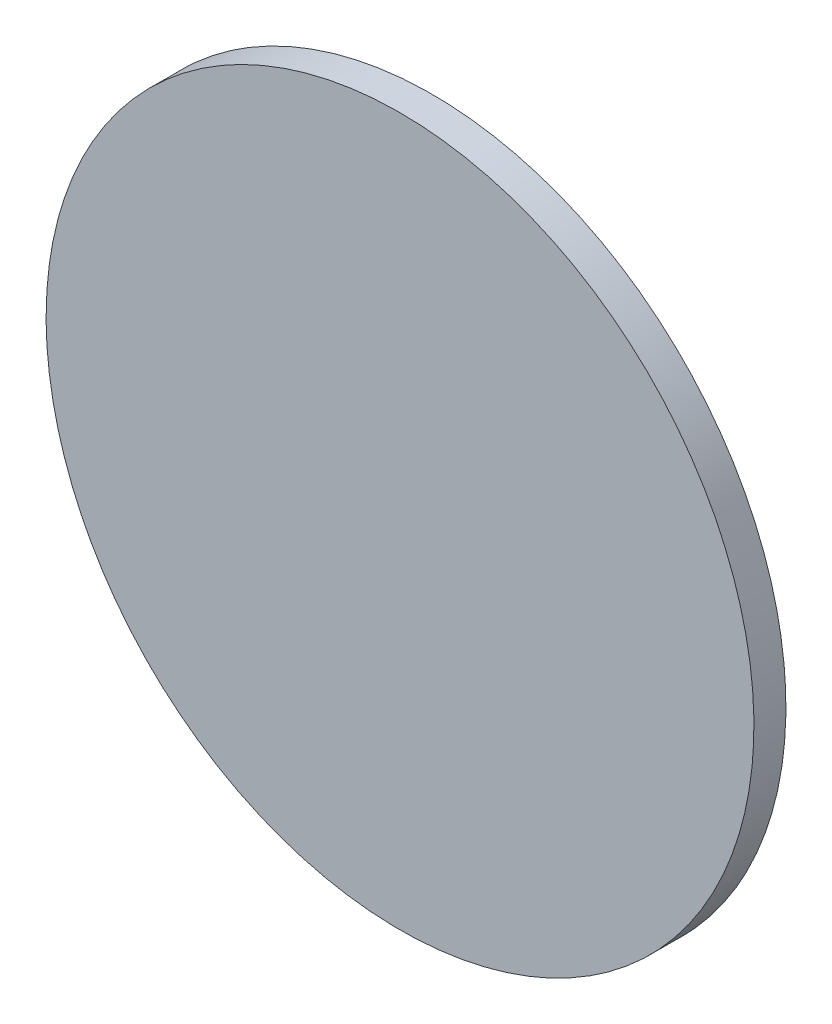
ISO-10303-21;
HEADER;
FILE_DESCRIPTION(('STEP AP214'),'2;1');
FILE_NAME('part.step','',(''),(''),'','','');
FILE_SCHEMA(('AUTOMOTIVE_DESIGN { 1 0 10303 214 1 1 1 1 }'));
ENDSEC;
DATA;
#1=APPLICATION_CONTEXT('core data for automotive mechanical design processes');
#2=APPLICATION_PROTOCOL_DEFINITION('international standard','automotive_design',2000,#1);
#3=PRODUCT_CONTEXT('',#1,'mechanical');
#4=PRODUCT('Part','Part','',(#3));
#5=PRODUCT_RELATED_PRODUCT_CATEGORY('part','',(#4));
#6=PRODUCT_DEFINITION_FORMATION('','',#4);
#7=PRODUCT_DEFINITION_CONTEXT('part definition',#1,'design');
#8=PRODUCT_DEFINITION('design','',#6,#7);
#9=PRODUCT_DEFINITION_SHAPE('','',#8);
#10=(LENGTH_UNIT() NAMED_UNIT(*) SI_UNIT(.MILLI.,.METRE.));
#11=(NAMED_UNIT(*) PLANE_ANGLE_UNIT() SI_UNIT($,.RADIAN.));
#12=(NAMED_UNIT(*) SI_UNIT($,.STERADIAN.) SOLID_ANGLE_UNIT());
#13=UNCERTAINTY_MEASURE_WITH_UNIT(LENGTH_MEASURE(1.E-05),#10,'distance_accuracy_value','');
#14=(GEOMETRIC_REPRESENTATION_CONTEXT(3) GLOBAL_UNCERTAINTY_ASSIGNED_CONTEXT((#13)) GLOBAL_UNIT_ASSIGNED_CONTEXT((#10,
#11,#12)) REPRESENTATION_CONTEXT('',''));
#15=CARTESIAN_POINT('',(0.,0.,0.));
#16=DIRECTION('',(0.,0.,1.));
#17=DIRECTION('',(1.,0.,0.));
#18=AXIS2_PLACEMENT_3D('',#15,#16,#17);
#19=CARTESIAN_POINT('',(-436.583744518887,45.0553215198781,-2472.10581086716));
#20=CARTESIAN_POINT('',(-436.583744518887,55.1504735299684,-2472.10581086716));
#21=CARTESIAN_POINT('',(-435.591858486488,75.340777550149,-2472.10581086716));
#22=CARTESIAN_POINT('',(-431.14269994776,105.334568083134,-2472.10581086716));
#23=CARTESIAN_POINT('',(-423.775059747786,134.747836519727,-2472.10581086716));
#24=CARTESIAN_POINT('',(-413.559892289257,163.297317005955,-2472.10581086716));
#25=CARTESIAN_POINT('',(-400.595575218975,190.708062438002,-2472.10581086716));
#26=CARTESIAN_POINT('',(-385.006961997343,216.716092353121,-2472.10581086716));
#27=CARTESIAN_POINT('',(-366.94417949129,241.070935205793,-2472.10581086716));
#28=CARTESIAN_POINT('',(-346.581182170468,263.538040545635,-2472.10581086716));
#29=CARTESIAN_POINT('',(-324.114076830626,283.901037866456,-2472.10581086716));
#30=CARTESIAN_POINT('',(-299.759233977955,301.963820372509,-2472.10581086716));
#31=CARTESIAN_POINT('',(-273.751204062836,317.552433594141,-2472.10581086716));
#32=CARTESIAN_POINT('',(-246.340458630789,330.516750664423,-2472.10581086716));
#33=CARTESIAN_POINT('',(-217.790978144561,340.731918122953,-2472.10581086716));
#34=CARTESIAN_POINT('',(-188.377709707968,348.099558322926,-2472.10581086716));
#35=CARTESIAN_POINT('',(-158.383919174983,352.548716861654,-2472.10581086716));
#36=CARTESIAN_POINT('',(-128.098463144712,354.036545910253,-2472.10581086716));
#37=CARTESIAN_POINT('',(-97.8130071144409,352.548716861655,-2472.10581086716));
#38=CARTESIAN_POINT('',(-67.819216581456,348.099558322926,-2472.10581086716));
#39=CARTESIAN_POINT('',(-38.4059481448631,340.731918122953,-2472.10581086716));
#40=CARTESIAN_POINT('',(-9.85646765863512,330.516750664423,-2472.10581086716));
#41=CARTESIAN_POINT('',(17.5542777734124,317.552433594141,-2472.10581086716));
#42=CARTESIAN_POINT('',(43.5623076885309,301.963820372509,-2472.10581086716));
#43=CARTESIAN_POINT('',(67.9171505412025,283.901037866456,-2472.10581086716));
#44=CARTESIAN_POINT('',(90.3842558810449,263.538040545635,-2472.10581086716));
#45=CARTESIAN_POINT('',(110.747253201866,241.070935205793,-2472.10581086716));
#46=CARTESIAN_POINT('',(128.810035707919,216.716092353121,-2472.10581086716));
#47=CARTESIAN_POINT('',(144.398648929551,190.708062438002,-2472.10581086716));
#48=CARTESIAN_POINT('',(157.362965999833,163.297317005955,-2472.10581086716));
#49=CARTESIAN_POINT('',(167.578133458363,134.747836519727,-2472.10581086716));
#50=CARTESIAN_POINT('',(174.945773658336,105.334568083134,-2472.10581086716));
#51=CARTESIAN_POINT('',(179.394932197064,75.340777550149,-2472.10581086716));
#52=CARTESIAN_POINT('',(180.882761245663,45.0553215198782,-2472.10581086716));
#53=CARTESIAN_POINT('',(179.394932197065,14.7698654896071,-2472.10581086716));
#54=CARTESIAN_POINT('',(174.945773658336,-15.2239250433776,-2472.10581086716));
#55=CARTESIAN_POINT('',(167.578133458363,-44.6371934799706,-2472.10581086716));
#56=CARTESIAN_POINT('',(157.362965999833,-73.1866739661985,-2472.10581086716));
#57=CARTESIAN_POINT('',(144.398648929551,-100.597419398246,-2472.10581086716));
#58=CARTESIAN_POINT('',(128.810035707919,-126.605449313365,-2472.10581086716));
#59=CARTESIAN_POINT('',(110.747253201866,-150.960292166036,-2472.10581086716));
#60=CARTESIAN_POINT('',(90.3842558810448,-173.427397505879,-2472.10581086716));
#61=CARTESIAN_POINT('',(67.9171505412026,-193.790394826699,-2472.10581086716));
#62=CARTESIAN_POINT('',(43.5623076885308,-211.853177332753,-2472.10581086716));
#63=CARTESIAN_POINT('',(17.5542777734126,-227.441790554384,-2472.10581086716));
#64=CARTESIAN_POINT('',(-9.856467658635,-240.406107624667,-2472.10581086716));
#65=CARTESIAN_POINT('',(-38.4059481448629,-250.621275083197,-2472.10581086716));
#66=CARTESIAN_POINT('',(-67.8192165814558,-257.988915283169,-2472.10581086716));
#67=CARTESIAN_POINT('',(-97.8130071144408,-262.438073821898,-2472.10581086716));
#68=CARTESIAN_POINT('',(-128.098463144712,-263.925902870497,-2472.10581086716));
#69=CARTESIAN_POINT('',(-158.383919174983,-262.438073821898,-2472.10581086716));
#70=CARTESIAN_POINT('',(-188.377709707968,-257.98891528317,-2472.10581086716));
#71=CARTESIAN_POINT('',(-217.790978144561,-250.621275083196,-2472.10581086716));
#72=CARTESIAN_POINT('',(-246.340458630789,-240.406107624667,-2472.10581086716));
#73=CARTESIAN_POINT('',(-273.751204062836,-227.441790554385,-2472.10581086716));
#74=CARTESIAN_POINT('',(-299.759233977955,-211.853177332753,-2472.10581086716));
#75=CARTESIAN_POINT('',(-324.114076830626,-193.790394826699,-2472.10581086716));
#76=CARTESIAN_POINT('',(-346.581182170469,-173.427397505879,-2472.10581086716));
#77=CARTESIAN_POINT('',(-366.944179491289,-150.960292166036,-2472.10581086716));
#78=CARTESIAN_POINT('',(-385.006961997343,-126.605449313365,-2472.10581086716));
#79=CARTESIAN_POINT('',(-400.595575218974,-100.597419398246,-2472.10581086716));
#80=CARTESIAN_POINT('',(-413.559892289257,-73.1866739661988,-2472.10581086716));
#81=CARTESIAN_POINT('',(-423.775059747787,-44.6371934799708,-2472.10581086716));
#82=CARTESIAN_POINT('',(-431.142699947759,-15.2239250433779,-2472.10581086716));
#83=CARTESIAN_POINT('',(-435.591858486488,14.7698654896072,-2472.10581086716));
#84=CARTESIAN_POINT('',(-436.583744518887,34.9601695097878,-2472.10581086716));
#85=CARTESIAN_POINT('',(-436.583744518887,45.0553215198781,-2472.10581086716));
#86=B_SPLINE_CURVE_WITH_KNOTS('',3,(#19,#20,#21,#22,#23,#24,#25,#26,#27,#28,#29,#30,#31,#32,#33,
#34,#35,#36,#37,#38,#39,#40,#41,#42,#43,#44,#45,#46,#47,#48,#49,#50,#51,#52,#53,#54,#55,#56,#57,
#58,#59,#60,#61,#62,#63,#64,#65,#66,#67,#68,#69,#70,#71,#72,#73,#74,#75,#76,#77,#78,#79,#80,#81,
#82,#83,#84,#85),.UNSPECIFIED.,.T.,.F.,(4,1,1,1,1,1,1,1,1,1,1,1,1,1,1,1,1,1,1,1,1,1,1,1,1,1,1,1,
1,1,1,1,1,1,1,1,1,1,1,1,1,1,1,1,1,1,1,1,1,1,1,1,1,1,1,1,1,1,1,1,1,1,1,1,4),(0.,0.015625,0.03125,
0.046875,0.0625,0.078125,0.09375,0.109375,0.125,0.140625,0.15625,0.171875,0.1875,0.203125,
0.21875,0.234375,0.25,0.265625,0.28125,0.296875,0.3125,0.328125,0.34375,0.359375,0.375,0.390625,
0.40625,0.421875,0.4375,0.453125,0.46875,0.484375,0.5,0.515625,0.53125,0.546875,0.5625,0.578125,
0.59375,0.609375,0.625,0.640625,0.65625,0.671875,0.6875,0.703125,0.71875,0.734375,0.75,0.765625,
0.78125,0.796875,0.8125,0.828125,0.84375,0.859375,0.875,0.890625,0.90625,0.921875,0.9375,
0.953125,0.96875,0.984375,1.),.UNSPECIFIED.);
#87=DIRECTION('',(0.,0.,-1.));
#88=VECTOR('',#87,1.);
#89=SURFACE_OF_LINEAR_EXTRUSION('',#86,#88);
#90=CARTESIAN_POINT('',(-436.583744518887,45.0553215198781,-2472.10581086716));
#91=CARTESIAN_POINT('',(-436.583744518887,55.1504735299684,-2472.10581086716));
#92=CARTESIAN_POINT('',(-435.591858486488,75.340777550149,-2472.10581086716));
#93=CARTESIAN_POINT('',(-431.14269994776,105.334568083134,-2472.10581086716));
#94=CARTESIAN_POINT('',(-423.775059747786,134.747836519727,-2472.10581086716));
#95=CARTESIAN_POINT('',(-413.559892289257,163.297317005955,-2472.10581086716));
#96=CARTESIAN_POINT('',(-400.595575218975,190.708062438002,-2472.10581086716));
#97=CARTESIAN_POINT('',(-385.006961997343,216.716092353121,-2472.10581086716));
#98=CARTESIAN_POINT('',(-366.94417949129,241.070935205793,-2472.10581086716));
#99=CARTESIAN_POINT('',(-346.581182170468,263.538040545635,-2472.10581086716));
#100=CARTESIAN_POINT('',(-324.114076830626,283.901037866456,-2472.10581086716));
#101=CARTESIAN_POINT('',(-299.759233977955,301.963820372509,-2472.10581086716));
#102=CARTESIAN_POINT('',(-273.751204062836,317.552433594141,-2472.10581086716));
#103=CARTESIAN_POINT('',(-246.340458630789,330.516750664423,-2472.10581086716));
#104=CARTESIAN_POINT('',(-217.790978144561,340.731918122953,-2472.10581086716));
#105=CARTESIAN_POINT('',(-188.377709707968,348.099558322926,-2472.10581086716));
#106=CARTESIAN_POINT('',(-158.383919174983,352.548716861654,-2472.10581086716));
#107=CARTESIAN_POINT('',(-128.098463144712,354.036545910253,-2472.10581086716));
#108=CARTESIAN_POINT('',(-97.8130071144409,352.548716861655,-2472.10581086716));
#109=CARTESIAN_POINT('',(-67.819216581456,348.099558322926,-2472.10581086716));
#110=CARTESIAN_POINT('',(-38.4059481448631,340.731918122953,-2472.10581086716));
#111=CARTESIAN_POINT('',(-9.85646765863512,330.516750664423,-2472.10581086716));
#112=CARTESIAN_POINT('',(17.5542777734124,317.552433594141,-2472.10581086716));
#113=CARTESIAN_POINT('',(43.5623076885309,301.963820372509,-2472.10581086716));
#114=CARTESIAN_POINT('',(67.9171505412025,283.901037866456,-2472.10581086716));
#115=CARTESIAN_POINT('',(90.3842558810449,263.538040545635,-2472.10581086716));
#116=CARTESIAN_POINT('',(110.747253201866,241.070935205793,-2472.10581086716));
#117=CARTESIAN_POINT('',(128.810035707919,216.716092353121,-2472.10581086716));
#118=CARTESIAN_POINT('',(144.398648929551,190.708062438002,-2472.10581086716));
#119=CARTESIAN_POINT('',(157.362965999833,163.297317005955,-2472.10581086716));
#120=CARTESIAN_POINT('',(167.578133458363,134.747836519727,-2472.10581086716));
#121=CARTESIAN_POINT('',(174.945773658336,105.334568083134,-2472.10581086716));
#122=CARTESIAN_POINT('',(179.394932197064,75.340777550149,-2472.10581086716));
#123=CARTESIAN_POINT('',(180.882761245663,45.0553215198782,-2472.10581086716));
#124=CARTESIAN_POINT('',(179.394932197065,14.7698654896071,-2472.10581086716));
#125=CARTESIAN_POINT('',(174.945773658336,-15.2239250433776,-2472.10581086716));
#126=CARTESIAN_POINT('',(167.578133458363,-44.6371934799706,-2472.10581086716));
#127=CARTESIAN_POINT('',(157.362965999833,-73.1866739661985,-2472.10581086716));
#128=CARTESIAN_POINT('',(144.398648929551,-100.597419398246,-2472.10581086716));
#129=CARTESIAN_POINT('',(128.810035707919,-126.605449313365,-2472.10581086716));
#130=CARTESIAN_POINT('',(110.747253201866,-150.960292166036,-2472.10581086716));
#131=CARTESIAN_POINT('',(90.3842558810448,-173.427397505879,-2472.10581086716));
#132=CARTESIAN_POINT('',(67.9171505412026,-193.790394826699,-2472.10581086716));
#133=CARTESIAN_POINT('',(43.5623076885308,-211.853177332753,-2472.10581086716));
#134=CARTESIAN_POINT('',(17.5542777734126,-227.441790554384,-2472.10581086716));
#135=CARTESIAN_POINT('',(-9.856467658635,-240.406107624667,-2472.10581086716));
#136=CARTESIAN_POINT('',(-38.4059481448629,-250.621275083197,-2472.10581086716));
#137=CARTESIAN_POINT('',(-67.8192165814558,-257.988915283169,-2472.10581086716));
#138=CARTESIAN_POINT('',(-97.8130071144408,-262.438073821898,-2472.10581086716));
#139=CARTESIAN_POINT('',(-128.098463144712,-263.925902870497,-2472.10581086716));
#140=CARTESIAN_POINT('',(-158.383919174983,-262.438073821898,-2472.10581086716));
#141=CARTESIAN_POINT('',(-188.377709707968,-257.98891528317,-2472.10581086716));
#142=CARTESIAN_POINT('',(-217.790978144561,-250.621275083196,-2472.10581086716));
#143=CARTESIAN_POINT('',(-246.340458630789,-240.406107624667,-2472.10581086716));
#144=CARTESIAN_POINT('',(-273.751204062836,-227.441790554385,-2472.10581086716));
#145=CARTESIAN_POINT('',(-299.759233977955,-211.853177332753,-2472.10581086716));
#146=CARTESIAN_POINT('',(-324.114076830626,-193.790394826699,-2472.10581086716));
#147=CARTESIAN_POINT('',(-346.581182170469,-173.427397505879,-2472.10581086716));
#148=CARTESIAN_POINT('',(-366.944179491289,-150.960292166036,-2472.10581086716));
#149=CARTESIAN_POINT('',(-385.006961997343,-126.605449313365,-2472.10581086716));
#150=CARTESIAN_POINT('',(-400.595575218974,-100.597419398246,-2472.10581086716));
#151=CARTESIAN_POINT('',(-413.559892289257,-73.1866739661988,-2472.10581086716));
#152=CARTESIAN_POINT('',(-423.775059747787,-44.6371934799708,-2472.10581086716));
#153=CARTESIAN_POINT('',(-431.142699947759,-15.2239250433779,-2472.10581086716));
#154=CARTESIAN_POINT('',(-435.591858486488,14.7698654896072,-2472.10581086716));
#155=CARTESIAN_POINT('',(-436.583744518887,34.9601695097878,-2472.10581086716));
#156=CARTESIAN_POINT('',(-436.583744518887,45.0553215198781,-2472.10581086716));
#157=B_SPLINE_CURVE_WITH_KNOTS('',3,(#90,#91,#92,#93,#94,#95,#96,#97,#98,#99,#100,#101,#102,
#103,#104,#105,#106,#107,#108,#109,#110,#111,#112,#113,#114,#115,#116,#117,#118,#119,#120,#121,
#122,#123,#124,#125,#126,#127,#128,#129,#130,#131,#132,#133,#134,#135,#136,#137,#138,#139,#140,
#141,#142,#143,#144,#145,#146,#147,#148,#149,#150,#151,#152,#153,#154,#155,#156),.UNSPECIFIED.,
.T.,.F.,(4,1,1,1,1,1,1,1,1,1,1,1,1,1,1,1,1,1,1,1,1,1,1,1,1,1,1,1,1,1,1,1,1,1,1,1,1,1,1,1,1,1,1,
1,1,1,1,1,1,1,1,1,1,1,1,1,1,1,1,1,1,1,1,1,4),(0.,0.015625,0.03125,0.046875,0.0625,0.078125,
0.09375,0.109375,0.125,0.140625,0.15625,0.171875,0.1875,0.203125,0.21875,0.234375,0.25,0.265625,
0.28125,0.296875,0.3125,0.328125,0.34375,0.359375,0.375,0.390625,0.40625,0.421875,0.4375,
0.453125,0.46875,0.484375,0.5,0.515625,0.53125,0.546875,0.5625,0.578125,0.59375,0.609375,0.625,
0.640625,0.65625,0.671875,0.6875,0.703125,0.71875,0.734375,0.75,0.765625,0.78125,0.796875,
0.8125,0.828125,0.84375,0.859375,0.875,0.890625,0.90625,0.921875,0.9375,0.953125,0.96875,
0.984375,1.),.UNSPECIFIED.);
#158=CARTESIAN_POINT('',(-436.583744518887,45.0553215198781,-2472.10581086716));
#159=VERTEX_POINT('',#158);
#160=EDGE_CURVE('E9',#159,#159,#157,.T.);
#161=ORIENTED_EDGE('',*,*,#160,.T.);
#162=EDGE_LOOP('',(#161));
#163=FACE_BOUND('',#162,.T.);
#164=CARTESIAN_POINT('',(-436.583744518887,45.0553215198781,-2499.99899999999));
#165=CARTESIAN_POINT('',(-436.583744518887,40.007745514833,-2499.99899999999));
#166=CARTESIAN_POINT('',(-436.459758764838,34.9601695097878,-2499.99899999999));
#167=CARTESIAN_POINT('',(-435.964412773932,24.8771702287511,-2499.99899999999));
#168=CARTESIAN_POINT('',(-435.593052537077,19.8417469527596,-2499.99899999999));
#169=CARTESIAN_POINT('',(-434.603554605856,9.79520585888358,-2499.99899999999));
#170=CARTESIAN_POINT('',(-433.98541691149,4.78408804099918,-2499.99899999999));
#171=CARTESIAN_POINT('',(-432.504149391451,-5.20180644503305,-2499.99899999999));
#172=CARTESIAN_POINT('',(-431.641019565777,-10.1765831131809,-2499.99899999999));
#173=CARTESIAN_POINT('',(-429.671553109327,-20.0777596081105,-2499.99899999999));
#174=CARTESIAN_POINT('',(-428.56521647855,-25.0041594348923,-2499.99899999999));
#175=CARTESIAN_POINT('',(-426.112292845338,-34.7967795031744,-2499.99899999999));
#176=CARTESIAN_POINT('',(-424.765705842902,-39.6629997446746,-2499.99899999999));
#177=CARTESIAN_POINT('',(-421.835237899819,-49.3234578984781,-2499.99899999999));
#178=CARTESIAN_POINT('',(-420.25135695917,-54.1176958107813,-2499.99899999999));
#179=CARTESIAN_POINT('',(-416.850400208277,-63.622733176865,-2499.99899999999));
#180=CARTESIAN_POINT('',(-415.033324398032,-68.3335326306455,-2499.99899999999));
#181=CARTESIAN_POINT('',(-411.170076976564,-77.660236950358,-2499.99899999999));
#182=CARTESIAN_POINT('',(-409.12390536534,-82.2761418162901,-2499.99899999999));
#183=CARTESIAN_POINT('',(-404.807668569429,-91.4020577743581,-2499.99899999999));
#184=CARTESIAN_POINT('',(-402.537603384742,-95.912068866494,-2499.99899999999));
#185=CARTESIAN_POINT('',(-397.778781669424,-104.815198091022,-2499.99899999999));
#186=CARTESIAN_POINT('',(-395.290025138791,-109.208316223414,-2499.99899999999));
#187=CARTESIAN_POINT('',(-390.100076017703,-117.867223214057,-2499.99899999999));
#188=CARTESIAN_POINT('',(-387.398883427246,-122.133012072308,-2499.99899999999));
#189=CARTESIAN_POINT('',(-381.790317472632,-130.526824200273,-2499.99899999999));
#190=CARTESIAN_POINT('',(-378.882944108474,-134.654847469987,-2499.99899999999));
#191=CARTESIAN_POINT('',(-372.869264709359,-142.763355485444,-2499.99899999999));
#192=CARTESIAN_POINT('',(-369.762958674401,-146.743840231189,-2499.99899999999));
#193=CARTESIAN_POINT('',(-363.358662036589,-154.547498263274,-2499.99899999999));
#194=CARTESIAN_POINT('',(-360.060671433734,-158.370671549616,-2499.99899999999));
#195=CARTESIAN_POINT('',(-353.281176776616,-165.850691225138,-2499.99899999999));
#196=CARTESIAN_POINT('',(-349.799672722354,-169.50753761432,-2499.99899999999));
#197=CARTESIAN_POINT('',(-342.66132227891,-176.645888057763,-2499.99899999999));
#198=CARTESIAN_POINT('',(-339.004475889729,-180.127392112026,-2499.99899999999));
#199=CARTESIAN_POINT('',(-331.524456214206,-186.906886769144,-2499.99899999999));
#200=CARTESIAN_POINT('',(-327.701282927864,-190.204877371999,-2499.99899999999));
#201=CARTESIAN_POINT('',(-319.897624895779,-196.609174009811,-2499.99899999999));
#202=CARTESIAN_POINT('',(-315.917140150035,-199.715480044768,-2499.99899999999));
#203=CARTESIAN_POINT('',(-307.808632134577,-205.729159443884,-2499.99899999999));
#204=CARTESIAN_POINT('',(-303.680608864863,-208.636532808042,-2499.99899999999));
#205=CARTESIAN_POINT('',(-295.286796736898,-214.245098762656,-2499.99899999999));
#206=CARTESIAN_POINT('',(-291.021007878647,-216.946291353112,-2499.99899999999));
#207=CARTESIAN_POINT('',(-282.362100888004,-222.136240474201,-2499.99899999999));
#208=CARTESIAN_POINT('',(-277.968982755612,-224.624997004833,-2499.99899999999));
#209=CARTESIAN_POINT('',(-269.065853531084,-229.383818720152,-2499.99899999999));
#210=CARTESIAN_POINT('',(-264.555842438949,-231.653883904839,-2499.99899999999));
#211=CARTESIAN_POINT('',(-255.42992648088,-235.97012070075,-2499.99899999999));
#212=CARTESIAN_POINT('',(-250.814021614948,-238.016292311974,-2499.99899999999));
#213=CARTESIAN_POINT('',(-241.487317295236,-241.879539733442,-2499.99899999999));
#214=CARTESIAN_POINT('',(-236.776517841455,-243.696615543687,-2499.99899999999));
#215=CARTESIAN_POINT('',(-227.271480475372,-247.09757229458,-2499.99899999999));
#216=CARTESIAN_POINT('',(-222.477242563069,-248.681453235228,-2499.99899999999));
#217=CARTESIAN_POINT('',(-212.816784409265,-251.611921178312,-2499.99899999999));
#218=CARTESIAN_POINT('',(-207.950564167765,-252.958508180748,-2499.99899999999));
#219=CARTESIAN_POINT('',(-198.157944099483,-255.41143181396,-2499.99899999999));
#220=CARTESIAN_POINT('',(-193.231544272701,-256.517768444737,-2499.99899999999));
#221=CARTESIAN_POINT('',(-183.330367777771,-258.487234901187,-2499.99899999999));
#222=CARTESIAN_POINT('',(-178.355591109623,-259.350364726861,-2499.99899999999));
#223=CARTESIAN_POINT('',(-168.369696623591,-260.8316322469,-2499.99899999999));
#224=CARTESIAN_POINT('',(-163.358578805707,-261.449769941266,-2499.99899999999));
#225=CARTESIAN_POINT('',(-153.312037711831,-262.439267872487,-2499.99899999999));
#226=CARTESIAN_POINT('',(-148.276614435839,-262.810628109342,-2499.99899999999));
#227=CARTESIAN_POINT('',(-138.193615154803,-263.305974100248,-2499.99899999999));
#228=CARTESIAN_POINT('',(-133.146039149758,-263.429959854298,-2499.99899999999));
#229=CARTESIAN_POINT('',(-123.050887139667,-263.429959854298,-2499.99899999999));
#230=CARTESIAN_POINT('',(-118.003311134622,-263.305974100248,-2499.99899999999));
#231=CARTESIAN_POINT('',(-107.920311853585,-262.810628109343,-2499.99899999999));
#232=CARTESIAN_POINT('',(-102.884888577594,-262.439267872487,-2499.99899999999));
#233=CARTESIAN_POINT('',(-92.8383474837178,-261.449769941266,-2499.99899999999));
#234=CARTESIAN_POINT('',(-87.8272296658334,-260.8316322469,-2499.99899999999));
#235=CARTESIAN_POINT('',(-77.8413351798011,-259.350364726861,-2499.99899999999));
#236=CARTESIAN_POINT('',(-72.8665585116533,-258.487234901187,-2499.99899999999));
#237=CARTESIAN_POINT('',(-62.9653820167237,-256.517768444737,-2499.99899999999));
#238=CARTESIAN_POINT('',(-58.0389821899419,-255.41143181396,-2499.99899999999));
#239=CARTESIAN_POINT('',(-48.2463621216598,-252.958508180748,-2499.99899999999));
#240=CARTESIAN_POINT('',(-43.3801418801595,-251.611921178312,-2499.99899999999));
#241=CARTESIAN_POINT('',(-33.7196837263561,-248.681453235229,-2499.99899999999));
#242=CARTESIAN_POINT('',(-28.9254458140529,-247.09757229458,-2499.99899999999));
#243=CARTESIAN_POINT('',(-19.4204084479692,-243.696615543687,-2499.99899999999));
#244=CARTESIAN_POINT('',(-14.7096089941887,-241.879539733443,-2499.99899999999));
#245=CARTESIAN_POINT('',(-5.38290467447612,-238.016292311974,-2499.99899999999));
#246=CARTESIAN_POINT('',(-0.766999808544001,-235.97012070075,-2499.99899999999));
#247=CARTESIAN_POINT('',(8.358916149524,-231.653883904839,-2499.99899999999));
#248=CARTESIAN_POINT('',(12.8689272416599,-229.383818720153,-2499.99899999999));
#249=CARTESIAN_POINT('',(21.7720564661876,-224.624997004834,-2499.99899999999));
#250=CARTESIAN_POINT('',(26.1651745985794,-222.136240474201,-2499.99899999999));
#251=CARTESIAN_POINT('',(34.8240815892223,-216.946291353113,-2499.99899999999));
#252=CARTESIAN_POINT('',(39.0898704474734,-214.245098762657,-2499.99899999999));
#253=CARTESIAN_POINT('',(47.4836825754384,-208.636532808043,-2499.99899999999));
#254=CARTESIAN_POINT('',(51.6117058451524,-205.729159443885,-2499.99899999999));
#255=CARTESIAN_POINT('',(59.7202138606103,-199.715480044769,-2499.99899999999));
#256=CARTESIAN_POINT('',(63.7006986063544,-196.609174009811,-2499.99899999999));
#257=CARTESIAN_POINT('',(71.5043566384401,-190.204877371999,-2499.99899999999));
#258=CARTESIAN_POINT('',(75.3275299247816,-186.906886769144,-2499.99899999999));
#259=CARTESIAN_POINT('',(82.8075496003044,-180.127392112027,-2499.99899999999));
#260=CARTESIAN_POINT('',(86.4643959894856,-176.645888057764,-2499.99899999999));
#261=CARTESIAN_POINT('',(93.6027464329294,-169.50753761432,-2499.99899999999));
#262=CARTESIAN_POINT('',(97.0842504871922,-165.850691225139,-2499.99899999999));
#263=CARTESIAN_POINT('',(103.86374514431,-158.370671549616,-2499.99899999999));
#264=CARTESIAN_POINT('',(107.161735747165,-154.547498263275,-2499.99899999999));
#265=CARTESIAN_POINT('',(113.566032384977,-146.743840231189,-2499.99899999999));
#266=CARTESIAN_POINT('',(116.672338419935,-142.763355485445,-2499.99899999999));
#267=CARTESIAN_POINT('',(122.68601781905,-134.654847469987,-2499.99899999999));
#268=CARTESIAN_POINT('',(125.593391183208,-130.526824200273,-2499.99899999999));
#269=CARTESIAN_POINT('',(131.201957137822,-122.133012072308,-2499.99899999999));
#270=CARTESIAN_POINT('',(133.903149728278,-117.867223214057,-2499.99899999999));
#271=CARTESIAN_POINT('',(139.093098849367,-109.208316223414,-2499.99899999999));
#272=CARTESIAN_POINT('',(141.581855379999,-104.815198091022,-2499.99899999999));
#273=CARTESIAN_POINT('',(146.340677095318,-95.9120688664947,-2499.99899999999));
#274=CARTESIAN_POINT('',(148.610742280005,-91.4020577743588,-2499.99899999999));
#275=CARTESIAN_POINT('',(152.926979075916,-82.2761418162908,-2499.99899999999));
#276=CARTESIAN_POINT('',(154.97315068714,-77.6602369503586,-2499.99899999999));
#277=CARTESIAN_POINT('',(158.836398108609,-68.333532630646,-2499.99899999999));
#278=CARTESIAN_POINT('',(160.653473918853,-63.6227331768655,-2499.99899999999));
#279=CARTESIAN_POINT('',(164.054430669746,-54.1176958107817,-2499.99899999999));
#280=CARTESIAN_POINT('',(165.638311610395,-49.3234578984785,-2499.99899999999));
#281=CARTESIAN_POINT('',(168.568779553479,-39.662999744675,-2499.99899999999));
#282=CARTESIAN_POINT('',(169.915366555914,-34.7967795031748,-2499.99899999999));
#283=CARTESIAN_POINT('',(172.368290189126,-25.0041594348926,-2499.99899999999));
#284=CARTESIAN_POINT('',(173.474626819903,-20.0777596081108,-2499.99899999999));
#285=CARTESIAN_POINT('',(175.444093276354,-10.1765831131812,-2499.99899999999));
#286=CARTESIAN_POINT('',(176.307223102027,-5.20180644503341,-2499.99899999999));
#287=CARTESIAN_POINT('',(177.788490622066,4.78408804099877,-2499.99899999999));
#288=CARTESIAN_POINT('',(178.406628316432,9.79520585888316,-2499.99899999999));
#289=CARTESIAN_POINT('',(179.396126247653,19.8417469527591,-2499.99899999999));
#290=CARTESIAN_POINT('',(179.767486484509,24.8771702287507,-2499.99899999999));
#291=CARTESIAN_POINT('',(180.262832475414,34.9601695097874,-2499.99899999999));
#292=CARTESIAN_POINT('',(180.386818229464,40.0077455148326,-2499.99899999999));
#293=CARTESIAN_POINT('',(180.386818229464,50.1028975249229,-2499.99899999999));
#294=CARTESIAN_POINT('',(180.262832475414,55.150473529968,-2499.99899999999));
#295=CARTESIAN_POINT('',(179.767486484509,65.2334728110047,-2499.99899999999));
#296=CARTESIAN_POINT('',(179.396126247654,70.2688960869963,-2499.99899999999));
#297=CARTESIAN_POINT('',(178.406628316432,80.3154371808723,-2499.99899999999));
#298=CARTESIAN_POINT('',(177.788490622066,85.3265549987567,-2499.99899999999));
#299=CARTESIAN_POINT('',(176.307223102027,95.312449484789,-2499.99899999999));
#300=CARTESIAN_POINT('',(175.444093276354,100.287226152937,-2499.99899999999));
#301=CARTESIAN_POINT('',(173.474626819903,110.188402647866,-2499.99899999999));
#302=CARTESIAN_POINT('',(172.368290189126,115.114802474648,-2499.99899999999));
#303=CARTESIAN_POINT('',(169.915366555914,124.90742254293,-2499.99899999999));
#304=CARTESIAN_POINT('',(168.568779553479,129.773642784431,-2499.99899999999));
#305=CARTESIAN_POINT('',(165.638311610395,139.434100938234,-2499.99899999999));
#306=CARTESIAN_POINT('',(164.054430669746,144.228338850537,-2499.99899999999));
#307=CARTESIAN_POINT('',(160.653473918853,153.733376216621,-2499.99899999999));
#308=CARTESIAN_POINT('',(158.836398108609,158.444175670402,-2499.99899999999));
#309=CARTESIAN_POINT('',(154.97315068714,167.770879990114,-2499.99899999999));
#310=CARTESIAN_POINT('',(152.926979075916,172.386784856046,-2499.99899999999));
#311=CARTESIAN_POINT('',(148.610742280005,181.512700814114,-2499.99899999999));
#312=CARTESIAN_POINT('',(146.340677095319,186.02271190625,-2499.99899999999));
#313=CARTESIAN_POINT('',(141.58185538,194.925841130778,-2499.99899999999));
#314=CARTESIAN_POINT('',(139.093098849367,199.31895926317,-2499.99899999999));
#315=CARTESIAN_POINT('',(133.903149728279,207.977866253813,-2499.99899999999));
#316=CARTESIAN_POINT('',(131.201957137823,212.243655112064,-2499.99899999999));
#317=CARTESIAN_POINT('',(125.593391183209,220.637467240029,-2499.99899999999));
#318=CARTESIAN_POINT('',(122.686017819051,224.765490509743,-2499.99899999999));
#319=CARTESIAN_POINT('',(116.672338419935,232.873998525201,-2499.99899999999));
#320=CARTESIAN_POINT('',(113.566032384977,236.854483270945,-2499.99899999999));
#321=CARTESIAN_POINT('',(107.161735747165,244.65814130303,-2499.99899999999));
#322=CARTESIAN_POINT('',(103.86374514431,248.481314589372,-2499.99899999999));
#323=CARTESIAN_POINT('',(97.0842504871927,255.961334264895,-2499.99899999999));
#324=CARTESIAN_POINT('',(93.60274643293,259.618180654076,-2499.99899999999));
#325=CARTESIAN_POINT('',(86.4643959894862,266.756531097519,-2499.99899999999));
#326=CARTESIAN_POINT('',(82.807549600305,270.238035151782,-2499.99899999999));
#327=CARTESIAN_POINT('',(75.3275299247822,277.0175298089,-2499.99899999999));
#328=CARTESIAN_POINT('',(71.5043566384406,280.315520411755,-2499.99899999999));
#329=CARTESIAN_POINT('',(63.700698606355,286.719817049567,-2499.99899999999));
#330=CARTESIAN_POINT('',(59.7202138606109,289.826123084525,-2499.99899999999));
#331=CARTESIAN_POINT('',(51.611705845153,295.83980248364,-2499.99899999999));
#332=CARTESIAN_POINT('',(47.4836825754391,298.747175847798,-2499.99899999999));
#333=CARTESIAN_POINT('',(39.089870447474,304.355741802413,-2499.99899999999));
#334=CARTESIAN_POINT('',(34.8240815892229,307.056934392869,-2499.99899999999));
#335=CARTESIAN_POINT('',(26.16517459858,312.246883513957,-2499.99899999999));
#336=CARTESIAN_POINT('',(21.7720564661882,314.73564004459,-2499.99899999999));
#337=CARTESIAN_POINT('',(12.8689272416605,319.494461759909,-2499.99899999999));
#338=CARTESIAN_POINT('',(8.35891614952465,321.764526944595,-2499.99899999999));
#339=CARTESIAN_POINT('',(-0.766999808543327,326.080763740506,-2499.99899999999));
#340=CARTESIAN_POINT('',(-5.38290467447544,328.12693535173,-2499.99899999999));
#341=CARTESIAN_POINT('',(-14.709608994188,331.990182773199,-2499.99899999999));
#342=CARTESIAN_POINT('',(-19.4204084479685,333.807258583443,-2499.99899999999));
#343=CARTESIAN_POINT('',(-28.9254458140522,337.208215334336,-2499.99899999999));
#344=CARTESIAN_POINT('',(-33.7196837263554,338.792096274985,-2499.99899999999));
#345=CARTESIAN_POINT('',(-43.3801418801588,341.722564218069,-2499.99899999999));
#346=CARTESIAN_POINT('',(-48.2463621216591,343.069151220504,-2499.99899999999));
#347=CARTESIAN_POINT('',(-58.0389821899412,345.522074853716,-2499.99899999999));
#348=CARTESIAN_POINT('',(-62.9653820167231,346.628411484493,-2499.99899999999));
#349=CARTESIAN_POINT('',(-72.8665585116527,348.597877940944,-2499.99899999999));
#350=CARTESIAN_POINT('',(-77.8413351798005,349.461007766617,-2499.99899999999));
#351=CARTESIAN_POINT('',(-87.8272296658328,350.942275286656,-2499.99899999999));
#352=CARTESIAN_POINT('',(-92.8383474837172,351.560412981022,-2499.99899999999));
#353=CARTESIAN_POINT('',(-102.884888577593,352.549910912243,-2499.99899999999));
#354=CARTESIAN_POINT('',(-107.920311853585,352.921271149099,-2499.99899999999));
#355=CARTESIAN_POINT('',(-118.003311134621,353.416617140004,-2499.99899999999));
#356=CARTESIAN_POINT('',(-123.050887139667,353.540602894054,-2499.99899999999));
#357=CARTESIAN_POINT('',(-133.146039149757,353.540602894054,-2499.99899999999));
#358=CARTESIAN_POINT('',(-138.193615154802,353.416617140004,-2499.99899999999));
#359=CARTESIAN_POINT('',(-148.276614435839,352.921271149099,-2499.99899999999));
#360=CARTESIAN_POINT('',(-153.31203771183,352.549910912243,-2499.99899999999));
#361=CARTESIAN_POINT('',(-163.358578805706,351.560412981022,-2499.99899999999));
#362=CARTESIAN_POINT('',(-168.369696623591,350.942275286656,-2499.99899999999));
#363=CARTESIAN_POINT('',(-178.355591109623,349.461007766617,-2499.99899999999));
#364=CARTESIAN_POINT('',(-183.330367777771,348.597877940944,-2499.99899999999));
#365=CARTESIAN_POINT('',(-193.2315442727,346.628411484493,-2499.99899999999));
#366=CARTESIAN_POINT('',(-198.157944099482,345.522074853716,-2499.99899999999));
#367=CARTESIAN_POINT('',(-207.950564167764,343.069151220504,-2499.99899999999));
#368=CARTESIAN_POINT('',(-212.816784409265,341.722564218069,-2499.99899999999));
#369=CARTESIAN_POINT('',(-222.477242563068,338.792096274985,-2499.99899999999));
#370=CARTESIAN_POINT('',(-227.271480475371,337.208215334337,-2499.99899999999));
#371=CARTESIAN_POINT('',(-236.776517841455,333.807258583443,-2499.99899999999));
#372=CARTESIAN_POINT('',(-241.487317295235,331.990182773199,-2499.99899999999));
#373=CARTESIAN_POINT('',(-250.814021614948,328.12693535173,-2499.99899999999));
#374=CARTESIAN_POINT('',(-255.42992648088,326.080763740506,-2499.99899999999));
#375=CARTESIAN_POINT('',(-264.555842438948,321.764526944595,-2499.99899999999));
#376=CARTESIAN_POINT('',(-269.065853531084,319.494461759909,-2499.99899999999));
#377=CARTESIAN_POINT('',(-277.968982755612,314.73564004459,-2499.99899999999));
#378=CARTESIAN_POINT('',(-282.362100888004,312.246883513957,-2499.99899999999));
#379=CARTESIAN_POINT('',(-291.021007878646,307.056934392869,-2499.99899999999));
#380=CARTESIAN_POINT('',(-295.286796736898,304.355741802413,-2499.99899999999));
#381=CARTESIAN_POINT('',(-303.680608864863,298.747175847799,-2499.99899999999));
#382=CARTESIAN_POINT('',(-307.808632134577,295.83980248364,-2499.99899999999));
#383=CARTESIAN_POINT('',(-315.917140150035,289.826123084525,-2499.99899999999));
#384=CARTESIAN_POINT('',(-319.897624895779,286.719817049567,-2499.99899999999));
#385=CARTESIAN_POINT('',(-327.701282927864,280.315520411755,-2499.99899999999));
#386=CARTESIAN_POINT('',(-331.524456214206,277.0175298089,-2499.99899999999));
#387=CARTESIAN_POINT('',(-339.004475889728,270.238035151783,-2499.99899999999));
#388=CARTESIAN_POINT('',(-342.66132227891,266.75653109752,-2499.99899999999));
#389=CARTESIAN_POINT('',(-349.799672722353,259.618180654076,-2499.99899999999));
#390=CARTESIAN_POINT('',(-353.281176776616,255.961334264895,-2499.99899999999));
#391=CARTESIAN_POINT('',(-360.060671433734,248.481314589372,-2499.99899999999));
#392=CARTESIAN_POINT('',(-363.358662036589,244.658141303031,-2499.99899999999));
#393=CARTESIAN_POINT('',(-369.762958674401,236.854483270945,-2499.99899999999));
#394=CARTESIAN_POINT('',(-372.869264709359,232.873998525201,-2499.99899999999));
#395=CARTESIAN_POINT('',(-378.882944108474,224.765490509743,-2499.99899999999));
#396=CARTESIAN_POINT('',(-381.790317472632,220.637467240029,-2499.99899999999));
#397=CARTESIAN_POINT('',(-387.398883427246,212.243655112064,-2499.99899999999));
#398=CARTESIAN_POINT('',(-390.100076017702,207.977866253813,-2499.99899999999));
#399=CARTESIAN_POINT('',(-395.290025138791,199.31895926317,-2499.99899999999));
#400=CARTESIAN_POINT('',(-397.778781669423,194.925841130778,-2499.99899999999));
#401=CARTESIAN_POINT('',(-402.537603384742,186.02271190625,-2499.99899999999));
#402=CARTESIAN_POINT('',(-404.807668569429,181.512700814115,-2499.99899999999));
#403=CARTESIAN_POINT('',(-409.12390536534,172.386784856047,-2499.99899999999));
#404=CARTESIAN_POINT('',(-411.170076976564,167.770879990115,-2499.99899999999));
#405=CARTESIAN_POINT('',(-415.033324398032,158.444175670402,-2499.99899999999));
#406=CARTESIAN_POINT('',(-416.850400208277,153.733376216621,-2499.99899999999));
#407=CARTESIAN_POINT('',(-420.25135695917,144.228338850538,-2499.99899999999));
#408=CARTESIAN_POINT('',(-421.835237899818,139.434100938234,-2499.99899999999));
#409=CARTESIAN_POINT('',(-424.765705842902,129.773642784431,-2499.99899999999));
#410=CARTESIAN_POINT('',(-426.112292845338,124.907422542931,-2499.99899999999));
#411=CARTESIAN_POINT('',(-428.56521647855,115.114802474649,-2499.99899999999));
#412=CARTESIAN_POINT('',(-429.671553109327,110.188402647867,-2499.99899999999));
#413=CARTESIAN_POINT('',(-431.641019565777,100.287226152937,-2499.99899999999));
#414=CARTESIAN_POINT('',(-432.504149391451,95.3124494847894,-2499.99899999999));
#415=CARTESIAN_POINT('',(-433.98541691149,85.3265549987571,-2499.99899999999));
#416=CARTESIAN_POINT('',(-434.603554605856,80.3154371808727,-2499.99899999999));
#417=CARTESIAN_POINT('',(-435.593052537077,70.2688960869967,-2499.99899999999));
#418=CARTESIAN_POINT('',(-435.964412773932,65.2334728110051,-2499.99899999999));
#419=CARTESIAN_POINT('',(-436.459758764838,55.1504735299684,-2499.99899999999));
#420=CARTESIAN_POINT('',(-436.583744518888,50.1028975249233,-2499.99899999999));
#421=CARTESIAN_POINT('',(-436.583744518887,45.0553215198781,-2499.99899999999));
#422=B_SPLINE_CURVE_WITH_KNOTS('',3,(#164,#165,#166,#167,#168,#169,#170,#171,#172,#173,#174,
#175,#176,#177,#178,#179,#180,#181,#182,#183,#184,#185,#186,#187,#188,#189,#190,#191,#192,#193,
#194,#195,#196,#197,#198,#199,#200,#201,#202,#203,#204,#205,#206,#207,#208,#209,#210,#211,#212,
#213,#214,#215,#216,#217,#218,#219,#220,#221,#222,#223,#224,#225,#226,#227,#228,#229,#230,#231,
#232,#233,#234,#235,#236,#237,#238,#239,#240,#241,#242,#243,#244,#245,#246,#247,#248,#249,#250,
#251,#252,#253,#254,#255,#256,#257,#258,#259,#260,#261,#262,#263,#264,#265,#266,#267,#268,#269,
#270,#271,#272,#273,#274,#275,#276,#277,#278,#279,#280,#281,#282,#283,#284,#285,#286,#287,#288,
#289,#290,#291,#292,#293,#294,#295,#296,#297,#298,#299,#300,#301,#302,#303,#304,#305,#306,#307,
#308,#309,#310,#311,#312,#313,#314,#315,#316,#317,#318,#319,#320,#321,#322,#323,#324,#325,#326,
#327,#328,#329,#330,#331,#332,#333,#334,#335,#336,#337,#338,#339,#340,#341,#342,#343,#344,#345,
#346,#347,#348,#349,#350,#351,#352,#353,#354,#355,#356,#357,#358,#359,#360,#361,#362,#363,#364,
#365,#366,#367,#368,#369,#370,#371,#372,#373,#374,#375,#376,#377,#378,#379,#380,#381,#382,#383,
#384,#385,#386,#387,#388,#389,#390,#391,#392,#393,#394,#395,#396,#397,#398,#399,#400,#401,#402,
#403,#404,#405,#406,#407,#408,#409,#410,#411,#412,#413,#414,#415,#416,#417,#418,#419,#420,#421),
.UNSPECIFIED.,.F.,.F.,(4,2,2,2,2,2,2,2,2,2,2,2,2,2,2,2,2,2,2,2,2,2,2,2,2,2,2,2,2,2,2,2,2,2,2,2,
2,2,2,2,2,2,2,2,2,2,2,2,2,2,2,2,2,2,2,2,2,2,2,2,2,2,2,2,2,2,2,2,2,2,2,2,2,2,2,2,2,2,2,2,2,2,2,2,
2,2,2,2,2,2,2,2,2,2,2,2,2,2,2,2,2,2,2,2,2,2,2,2,2,2,2,2,2,2,2,2,2,2,2,2,2,2,2,2,2,2,2,2,4),(0.,
15.1412137366182,30.2824274732364,45.4236412098545,60.5648549464726,75.7060686830908,
90.8472824197089,105.988496156327,121.129709892945,136.270923629563,151.412137366182,
166.5533511028,181.694564839418,196.835778576036,211.976992312654,227.118206049273,
242.259419785891,257.400633522509,272.541847259127,287.683060995745,302.824274732363,
317.965488468982,333.1067022056,348.247915942218,363.389129678836,378.530343415454,
393.671557152072,408.812770888691,423.953984625309,439.095198361927,454.236412098545,
469.377625835163,484.518839571781,499.6600533084,514.801267045018,529.942480781636,
545.083694518254,560.224908254872,575.36612199149,590.507335728109,605.648549464727,
620.789763201345,635.930976937963,651.072190674581,666.213404411199,681.354618147818,
696.495831884436,711.637045621054,726.778259357672,741.91947309429,757.060686830909,
772.201900567527,787.343114304145,802.484328040763,817.625541777381,832.766755514,
847.907969250618,863.049182987236,878.190396723854,893.331610460473,908.472824197091,
923.614037933709,938.755251670327,953.896465406945,969.037679143564,984.178892880182,
999.3201066168,1014.46132035342,1029.60253409004,1044.74374782665,1059.88496156327,
1075.02617529989,1090.16738903651,1105.30860277313,1120.44981650975,1135.59103024636,
1150.73224398298,1165.8734577196,1181.01467145622,1196.15588519284,1211.29709892946,
1226.43831266607,1241.57952640269,1256.72074013931,1271.86195387593,1287.00316761255,
1302.14438134916,1317.28559508578,1332.4268088224,1347.56802255902,1362.70923629564,
1377.85045003226,1392.99166376887,1408.13287750549,1423.27409124211,1438.41530497873,
1453.55651871535,1468.69773245197,1483.83894618858,1498.9801599252,1514.12137366182,
1529.26258739844,1544.40380113506,1559.54501487167,1574.68622860829,1589.82744234491,
1604.96865608153,1620.10986981815,1635.25108355477,1650.39229729138,1665.533511028,
1680.67472476462,1695.81593850124,1710.95715223786,1726.09836597448,1741.23957971109,
1756.38079344771,1771.52200718433,1786.66322092095,1801.80443465757,1816.94564839418,
1832.0868621308,1847.22807586742,1862.36928960404,1877.51050334066,1892.65171707728,
1907.79293081389,1922.93414455051,1938.07535828713),.UNSPECIFIED.);
#423=CARTESIAN_POINT('',(-436.583744518887,45.0553215198781,-2499.99899999999));
#424=VERTEX_POINT('',#423);
#425=EDGE_CURVE('E24',#424,#424,#422,.F.);
#426=ORIENTED_EDGE('',*,*,#425,.F.);
#427=EDGE_LOOP('',(#426));
#428=FACE_BOUND('',#427,.T.);
#429=ADVANCED_FACE('F14',(#163,#428),#89,.T.);
#430=CARTESIAN_POINT('',(149.019943259409,159.970023938849,-2472.10581086716));
#431=DIRECTION('',(0.,0.,-1.));
#432=DIRECTION('',(0.,1.,0.));
#433=AXIS2_PLACEMENT_3D('',#430,#431,#432);
#434=PLANE('',#433);
#435=ORIENTED_EDGE('',*,*,#160,.F.);
#436=EDGE_LOOP('',(#435));
#437=FACE_BOUND('',#436,.T.);
#438=ADVANCED_FACE('F62',(#437),#434,.F.);
#439=CARTESIAN_POINT('',(149.019943259409,159.970023938849,-2499.99899999999));
#440=DIRECTION('',(0.,0.,-1.));
#441=DIRECTION('',(0.,1.,0.));
#442=AXIS2_PLACEMENT_3D('',#439,#440,#441);
#443=PLANE('',#442);
#444=ORIENTED_EDGE('',*,*,#425,.T.);
#445=EDGE_LOOP('',(#444));
#446=FACE_BOUND('',#445,.T.);
#447=ADVANCED_FACE('F31',(#446),#443,.T.);
#448=CLOSED_SHELL('',(#429,#438,#447));
#449=MANIFOLD_SOLID_BREP('B1',#448);
#450=ADVANCED_BREP_SHAPE_REPRESENTATION('',(#18,#449),#14);
#451=SHAPE_DEFINITION_REPRESENTATION(#9,#450);
ENDSEC;
END-ISO-10303-21;
